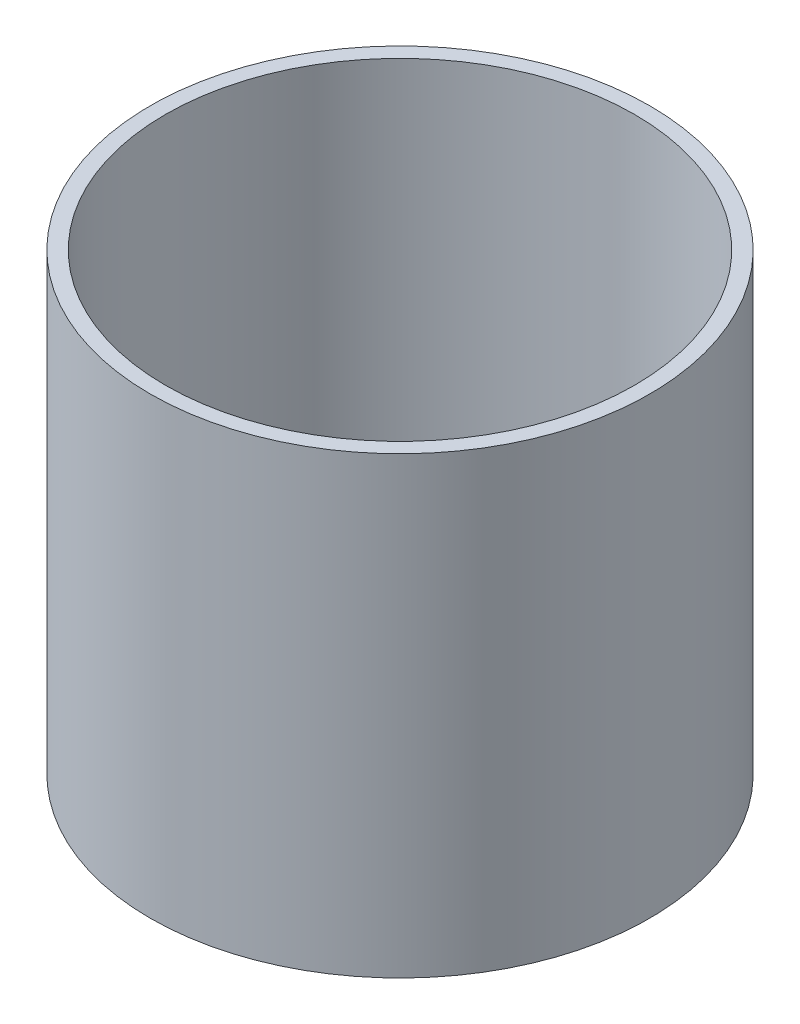
ISO-10303-21;
HEADER;
FILE_DESCRIPTION(('STEP AP214'),'2;1');
FILE_NAME('part.step','',(''),(''),'','','');
FILE_SCHEMA(('AUTOMOTIVE_DESIGN { 1 0 10303 214 1 1 1 1 }'));
ENDSEC;
DATA;
#1=APPLICATION_CONTEXT('core data for automotive mechanical design processes');
#2=APPLICATION_PROTOCOL_DEFINITION('international standard','automotive_design',2000,#1);
#3=PRODUCT_CONTEXT('',#1,'mechanical');
#4=PRODUCT('Part','Part','',(#3));
#5=PRODUCT_RELATED_PRODUCT_CATEGORY('part','',(#4));
#6=PRODUCT_DEFINITION_FORMATION('','',#4);
#7=PRODUCT_DEFINITION_CONTEXT('part definition',#1,'design');
#8=PRODUCT_DEFINITION('design','',#6,#7);
#9=PRODUCT_DEFINITION_SHAPE('','',#8);
#10=(LENGTH_UNIT() NAMED_UNIT(*) SI_UNIT(.MILLI.,.METRE.));
#11=(NAMED_UNIT(*) PLANE_ANGLE_UNIT() SI_UNIT($,.RADIAN.));
#12=(NAMED_UNIT(*) SI_UNIT($,.STERADIAN.) SOLID_ANGLE_UNIT());
#13=UNCERTAINTY_MEASURE_WITH_UNIT(LENGTH_MEASURE(1.E-05),#10,'distance_accuracy_value','');
#14=(GEOMETRIC_REPRESENTATION_CONTEXT(3) GLOBAL_UNCERTAINTY_ASSIGNED_CONTEXT((#13)) GLOBAL_UNIT_ASSIGNED_CONTEXT((#10,
#11,#12)) REPRESENTATION_CONTEXT('',''));
#15=CARTESIAN_POINT('',(0.,0.,0.));
#16=DIRECTION('',(0.,0.,1.));
#17=DIRECTION('',(1.,0.,0.));
#18=AXIS2_PLACEMENT_3D('',#15,#16,#17);
#19=CARTESIAN_POINT('',(0.,60.,0.));
#20=DIRECTION('',(0.,1.,0.));
#21=DIRECTION('',(0.,0.,1.));
#22=AXIS2_PLACEMENT_3D('',#19,#20,#21);
#23=PLANE('',#22);
#24=CARTESIAN_POINT('',(0.,60.,0.));
#25=DIRECTION('',(0.,1.,0.));
#26=DIRECTION('',(0.,0.,1.));
#27=AXIS2_PLACEMENT_3D('',#24,#25,#26);
#28=CIRCLE('',#27,33.);
#29=CARTESIAN_POINT('',(0.,60.,33.));
#30=VERTEX_POINT('',#29);
#31=EDGE_CURVE('E10',#30,#30,#28,.T.);
#32=ORIENTED_EDGE('',*,*,#31,.T.);
#33=EDGE_LOOP('',(#32));
#34=FACE_BOUND('',#33,.T.);
#35=CARTESIAN_POINT('',(0.,60.,0.));
#36=DIRECTION('',(0.,1.,0.));
#37=DIRECTION('',(0.,0.,1.));
#38=AXIS2_PLACEMENT_3D('',#35,#36,#37);
#39=CIRCLE('',#38,31.);
#40=CARTESIAN_POINT('',(0.,60.,31.));
#41=VERTEX_POINT('',#40);
#42=EDGE_CURVE('E54',#41,#41,#39,.T.);
#43=ORIENTED_EDGE('',*,*,#42,.F.);
#44=EDGE_LOOP('',(#43));
#45=FACE_BOUND('',#44,.T.);
#46=ADVANCED_FACE('F41',(#34,#45),#23,.T.);
#47=CARTESIAN_POINT('',(0.,0.,0.));
#48=DIRECTION('',(0.,1.,0.));
#49=DIRECTION('',(0.,0.,1.));
#50=AXIS2_PLACEMENT_3D('',#47,#48,#49);
#51=PLANE('',#50);
#52=CARTESIAN_POINT('',(0.,0.,0.));
#53=DIRECTION('',(0.,1.,0.));
#54=DIRECTION('',(0.,0.,1.));
#55=AXIS2_PLACEMENT_3D('',#52,#53,#54);
#56=CIRCLE('',#55,33.);
#57=CARTESIAN_POINT('',(0.,0.,33.));
#58=VERTEX_POINT('',#57);
#59=EDGE_CURVE('E45',#58,#58,#56,.T.);
#60=ORIENTED_EDGE('',*,*,#59,.F.);
#61=EDGE_LOOP('',(#60));
#62=FACE_BOUND('',#61,.T.);
#63=CARTESIAN_POINT('',(0.,0.,0.));
#64=DIRECTION('',(0.,1.,0.));
#65=DIRECTION('',(0.,0.,1.));
#66=AXIS2_PLACEMENT_3D('',#63,#64,#65);
#67=CIRCLE('',#66,31.);
#68=CARTESIAN_POINT('',(0.,0.,31.));
#69=VERTEX_POINT('',#68);
#70=EDGE_CURVE('E56',#69,#69,#67,.T.);
#71=ORIENTED_EDGE('',*,*,#70,.T.);
#72=EDGE_LOOP('',(#71));
#73=FACE_BOUND('',#72,.T.);
#74=ADVANCED_FACE('F68',(#62,#73),#51,.F.);
#75=CARTESIAN_POINT('',(0.,60.,0.));
#76=DIRECTION('',(0.,-1.,0.));
#77=DIRECTION('',(0.,0.,-1.));
#78=AXIS2_PLACEMENT_3D('',#75,#76,#77);
#79=CYLINDRICAL_SURFACE('',#78,33.);
#80=ORIENTED_EDGE('',*,*,#31,.F.);
#81=EDGE_LOOP('',(#80));
#82=FACE_BOUND('',#81,.T.);
#83=ORIENTED_EDGE('',*,*,#59,.T.);
#84=EDGE_LOOP('',(#83));
#85=FACE_BOUND('',#84,.T.);
#86=ADVANCED_FACE('F43',(#82,#85),#79,.T.);
#87=CARTESIAN_POINT('',(0.,60.,0.));
#88=DIRECTION('',(0.,-1.,0.));
#89=DIRECTION('',(0.,0.,-1.));
#90=AXIS2_PLACEMENT_3D('',#87,#88,#89);
#91=CYLINDRICAL_SURFACE('',#90,31.);
#92=ORIENTED_EDGE('',*,*,#42,.T.);
#93=EDGE_LOOP('',(#92));
#94=FACE_BOUND('',#93,.T.);
#95=ORIENTED_EDGE('',*,*,#70,.F.);
#96=EDGE_LOOP('',(#95));
#97=FACE_BOUND('',#96,.T.);
#98=ADVANCED_FACE('F64',(#94,#97),#91,.F.);
#99=CLOSED_SHELL('',(#46,#74,#86,#98));
#100=MANIFOLD_SOLID_BREP('B2',#99);
#101=ADVANCED_BREP_SHAPE_REPRESENTATION('',(#18,#100),#14);
#102=SHAPE_DEFINITION_REPRESENTATION(#9,#101);
ENDSEC;
END-ISO-10303-21;
